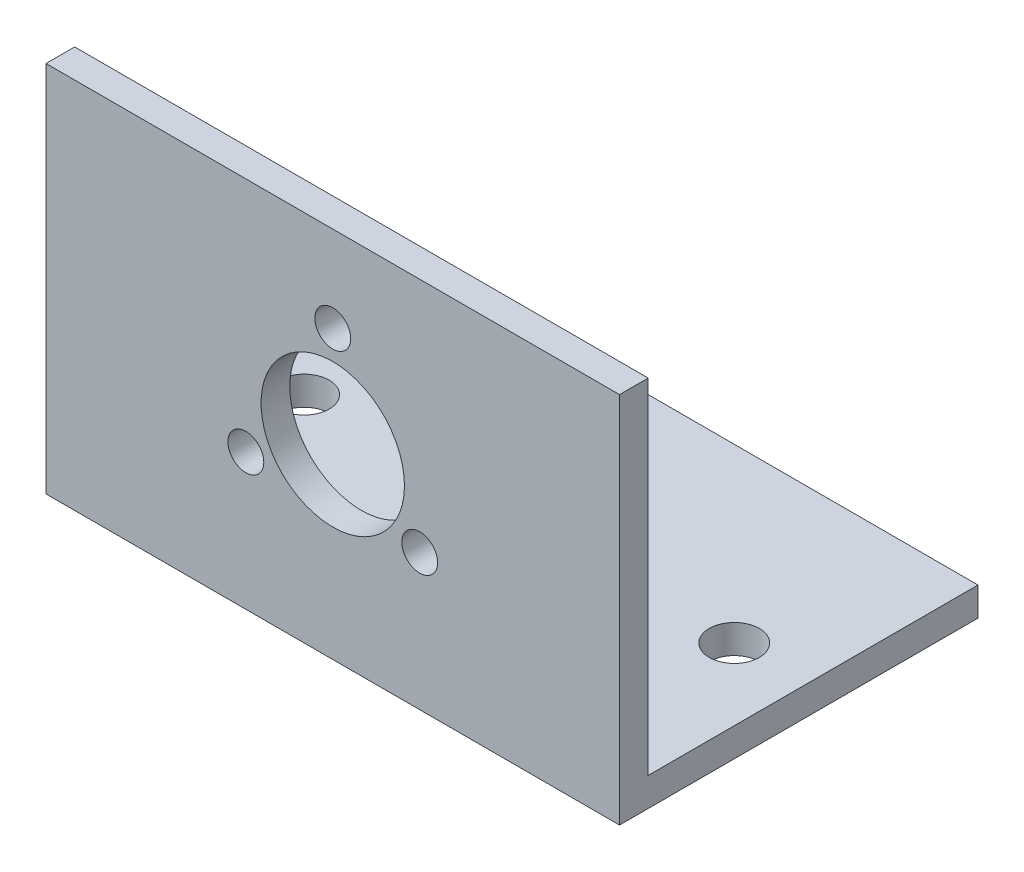
ISO-10303-21;
HEADER;
FILE_DESCRIPTION(('STEP AP214'),'2;1');
FILE_NAME('part.step','',(''),(''),'','','');
FILE_SCHEMA(('AUTOMOTIVE_DESIGN { 1 0 10303 214 1 1 1 1 }'));
ENDSEC;
DATA;
#1=APPLICATION_CONTEXT('core data for automotive mechanical design processes');
#2=APPLICATION_PROTOCOL_DEFINITION('international standard','automotive_design',2000,#1);
#3=PRODUCT_CONTEXT('',#1,'mechanical');
#4=PRODUCT('Part','Part','',(#3));
#5=PRODUCT_RELATED_PRODUCT_CATEGORY('part','',(#4));
#6=PRODUCT_DEFINITION_FORMATION('','',#4);
#7=PRODUCT_DEFINITION_CONTEXT('part definition',#1,'design');
#8=PRODUCT_DEFINITION('design','',#6,#7);
#9=PRODUCT_DEFINITION_SHAPE('','',#8);
#10=(LENGTH_UNIT() NAMED_UNIT(*) SI_UNIT(.MILLI.,.METRE.));
#11=(NAMED_UNIT(*) PLANE_ANGLE_UNIT() SI_UNIT($,.RADIAN.));
#12=(NAMED_UNIT(*) SI_UNIT($,.STERADIAN.) SOLID_ANGLE_UNIT());
#13=UNCERTAINTY_MEASURE_WITH_UNIT(LENGTH_MEASURE(1.E-05),#10,'distance_accuracy_value','');
#14=(GEOMETRIC_REPRESENTATION_CONTEXT(3) GLOBAL_UNCERTAINTY_ASSIGNED_CONTEXT((#13)) GLOBAL_UNIT_ASSIGNED_CONTEXT((#10,
#11,#12)) REPRESENTATION_CONTEXT('',''));
#15=CARTESIAN_POINT('',(0.,0.,0.));
#16=DIRECTION('',(0.,0.,1.));
#17=DIRECTION('',(1.,0.,0.));
#18=AXIS2_PLACEMENT_3D('',#15,#16,#17);
#19=CARTESIAN_POINT('',(0.,2.,0.));
#20=DIRECTION('',(0.,-1.,0.));
#21=DIRECTION('',(0.,0.,-1.));
#22=AXIS2_PLACEMENT_3D('',#19,#20,#21);
#23=PLANE('',#22);
#24=CARTESIAN_POINT('',(-15.,2.,-0.499999999999995));
#25=DIRECTION('',(0.,-1.,0.));
#26=DIRECTION('',(0.,0.,-1.));
#27=AXIS2_PLACEMENT_3D('',#24,#25,#26);
#28=CIRCLE('',#27,1.75);
#29=CARTESIAN_POINT('',(-15.,2.,-2.25));
#30=VERTEX_POINT('',#29);
#31=EDGE_CURVE('E157',#30,#30,#28,.T.);
#32=ORIENTED_EDGE('',*,*,#31,.T.);
#33=EDGE_LOOP('',(#32));
#34=FACE_BOUND('',#33,.T.);
#35=CARTESIAN_POINT('',(15.,2.,-0.49999999999999));
#36=DIRECTION('',(0.,-1.,0.));
#37=DIRECTION('',(0.,0.,-1.));
#38=AXIS2_PLACEMENT_3D('',#35,#36,#37);
#39=CIRCLE('',#38,1.75);
#40=CARTESIAN_POINT('',(15.,2.,-2.24999999999999));
#41=VERTEX_POINT('',#40);
#42=EDGE_CURVE('E152',#41,#41,#39,.T.);
#43=ORIENTED_EDGE('',*,*,#42,.T.);
#44=EDGE_LOOP('',(#43));
#45=FACE_BOUND('',#44,.T.);
#46=DIRECTION('',(-1.,0.,0.));
#47=VECTOR('',#46,1.);
#48=CARTESIAN_POINT('',(-20.,2.,10.5));
#49=LINE('',#48,#47);
#50=CARTESIAN_POINT('',(20.,2.,10.5));
#51=VERTEX_POINT('',#50);
#52=CARTESIAN_POINT('',(-20.,2.,10.5));
#53=VERTEX_POINT('',#52);
#54=EDGE_CURVE('E57',#51,#53,#49,.T.);
#55=ORIENTED_EDGE('',*,*,#54,.F.);
#56=DIRECTION('',(0.,0.,-1.));
#57=VECTOR('',#56,1.);
#58=CARTESIAN_POINT('',(20.,2.,12.5));
#59=LINE('',#58,#57);
#60=CARTESIAN_POINT('',(20.,2.,-12.5));
#61=VERTEX_POINT('',#60);
#62=EDGE_CURVE('E95',#51,#61,#59,.T.);
#63=ORIENTED_EDGE('',*,*,#62,.T.);
#64=DIRECTION('',(-1.,0.,0.));
#65=VECTOR('',#64,1.);
#66=CARTESIAN_POINT('',(-20.,2.,-12.5));
#67=LINE('',#66,#65);
#68=CARTESIAN_POINT('',(-20.,2.,-12.5));
#69=VERTEX_POINT('',#68);
#70=EDGE_CURVE('E63',#61,#69,#67,.T.);
#71=ORIENTED_EDGE('',*,*,#70,.T.);
#72=DIRECTION('',(0.,0.,1.));
#73=VECTOR('',#72,1.);
#74=CARTESIAN_POINT('',(-20.,2.,12.5));
#75=LINE('',#74,#73);
#76=EDGE_CURVE('E106',#69,#53,#75,.T.);
#77=ORIENTED_EDGE('',*,*,#76,.T.);
#78=EDGE_LOOP('',(#55,#63,#71,#77));
#79=FACE_BOUND('',#78,.T.);
#80=ADVANCED_FACE('F40',(#34,#45,#79),#23,.F.);
#81=CARTESIAN_POINT('',(20.,2.,12.5));
#82=DIRECTION('',(-1.,0.,0.));
#83=DIRECTION('',(0.,0.,1.));
#84=AXIS2_PLACEMENT_3D('',#81,#82,#83);
#85=PLANE('',#84);
#86=DIRECTION('',(0.,0.,-1.));
#87=VECTOR('',#86,1.);
#88=CARTESIAN_POINT('',(20.,0.,12.5));
#89=LINE('',#88,#87);
#90=CARTESIAN_POINT('',(20.,0.,12.5));
#91=VERTEX_POINT('',#90);
#92=CARTESIAN_POINT('',(20.,0.,-12.5));
#93=VERTEX_POINT('',#92);
#94=EDGE_CURVE('E102',#91,#93,#89,.T.);
#95=ORIENTED_EDGE('',*,*,#94,.T.);
#96=DIRECTION('',(0.,-1.,0.));
#97=VECTOR('',#96,1.);
#98=CARTESIAN_POINT('',(20.,2.,-12.5));
#99=LINE('',#98,#97);
#100=EDGE_CURVE('E11',#61,#93,#99,.T.);
#101=ORIENTED_EDGE('',*,*,#100,.F.);
#102=ORIENTED_EDGE('',*,*,#62,.F.);
#103=DIRECTION('',(0.,-1.,0.));
#104=VECTOR('',#103,1.);
#105=CARTESIAN_POINT('',(20.,26.,10.5));
#106=LINE('',#105,#104);
#107=CARTESIAN_POINT('',(20.,26.,10.5));
#108=VERTEX_POINT('',#107);
#109=EDGE_CURVE('E110',#108,#51,#106,.T.);
#110=ORIENTED_EDGE('',*,*,#109,.F.);
#111=DIRECTION('',(0.,0.,-1.));
#112=VECTOR('',#111,1.);
#113=CARTESIAN_POINT('',(20.,26.,10.5));
#114=LINE('',#113,#112);
#115=CARTESIAN_POINT('',(20.,26.,12.5));
#116=VERTEX_POINT('',#115);
#117=EDGE_CURVE('E105',#116,#108,#114,.T.);
#118=ORIENTED_EDGE('',*,*,#117,.F.);
#119=DIRECTION('',(0.,-1.,0.));
#120=VECTOR('',#119,1.);
#121=CARTESIAN_POINT('',(20.,2.,12.5));
#122=LINE('',#121,#120);
#123=EDGE_CURVE('E88',#116,#91,#122,.T.);
#124=ORIENTED_EDGE('',*,*,#123,.T.);
#125=EDGE_LOOP('',(#95,#101,#102,#110,#118,#124));
#126=FACE_BOUND('',#125,.T.);
#127=ADVANCED_FACE('F42',(#126),#85,.F.);
#128=CARTESIAN_POINT('',(-20.,2.,-12.5));
#129=DIRECTION('',(0.,0.,1.));
#130=DIRECTION('',(1.,0.,0.));
#131=AXIS2_PLACEMENT_3D('',#128,#129,#130);
#132=PLANE('',#131);
#133=DIRECTION('',(-1.,0.,0.));
#134=VECTOR('',#133,1.);
#135=CARTESIAN_POINT('',(-20.,0.,-12.5));
#136=LINE('',#135,#134);
#137=CARTESIAN_POINT('',(-20.,0.,-12.5));
#138=VERTEX_POINT('',#137);
#139=EDGE_CURVE('E109',#93,#138,#136,.T.);
#140=ORIENTED_EDGE('',*,*,#139,.T.);
#141=DIRECTION('',(0.,-1.,0.));
#142=VECTOR('',#141,1.);
#143=CARTESIAN_POINT('',(-20.,2.,-12.5));
#144=LINE('',#143,#142);
#145=EDGE_CURVE('E49',#69,#138,#144,.T.);
#146=ORIENTED_EDGE('',*,*,#145,.F.);
#147=ORIENTED_EDGE('',*,*,#70,.F.);
#148=ORIENTED_EDGE('',*,*,#100,.T.);
#149=EDGE_LOOP('',(#140,#146,#147,#148));
#150=FACE_BOUND('',#149,.T.);
#151=ADVANCED_FACE('F190',(#150),#132,.F.);
#152=CARTESIAN_POINT('',(-20.,2.,12.5));
#153=DIRECTION('',(1.,0.,0.));
#154=DIRECTION('',(0.,0.,-1.));
#155=AXIS2_PLACEMENT_3D('',#152,#153,#154);
#156=PLANE('',#155);
#157=DIRECTION('',(0.,0.,1.));
#158=VECTOR('',#157,1.);
#159=CARTESIAN_POINT('',(-20.,0.,12.5));
#160=LINE('',#159,#158);
#161=CARTESIAN_POINT('',(-20.,0.,12.5));
#162=VERTEX_POINT('',#161);
#163=EDGE_CURVE('E96',#138,#162,#160,.T.);
#164=ORIENTED_EDGE('',*,*,#163,.T.);
#165=DIRECTION('',(0.,-1.,0.));
#166=VECTOR('',#165,1.);
#167=CARTESIAN_POINT('',(-20.,2.,12.5));
#168=LINE('',#167,#166);
#169=CARTESIAN_POINT('',(-20.,26.,12.5));
#170=VERTEX_POINT('',#169);
#171=EDGE_CURVE('E91',#170,#162,#168,.T.);
#172=ORIENTED_EDGE('',*,*,#171,.F.);
#173=DIRECTION('',(0.,0.,1.));
#174=VECTOR('',#173,1.);
#175=CARTESIAN_POINT('',(-20.,26.,10.5));
#176=LINE('',#175,#174);
#177=CARTESIAN_POINT('',(-20.,26.,10.5));
#178=VERTEX_POINT('',#177);
#179=EDGE_CURVE('E160',#178,#170,#176,.T.);
#180=ORIENTED_EDGE('',*,*,#179,.F.);
#181=DIRECTION('',(0.,-1.,0.));
#182=VECTOR('',#181,1.);
#183=CARTESIAN_POINT('',(-20.,26.,10.5));
#184=LINE('',#183,#182);
#185=EDGE_CURVE('E114',#178,#53,#184,.T.);
#186=ORIENTED_EDGE('',*,*,#185,.T.);
#187=ORIENTED_EDGE('',*,*,#76,.F.);
#188=ORIENTED_EDGE('',*,*,#145,.T.);
#189=EDGE_LOOP('',(#164,#172,#180,#186,#187,#188));
#190=FACE_BOUND('',#189,.T.);
#191=ADVANCED_FACE('F181',(#190),#156,.F.);
#192=CARTESIAN_POINT('',(-20.,2.,12.5));
#193=DIRECTION('',(0.,0.,-1.));
#194=DIRECTION('',(-1.,0.,0.));
#195=AXIS2_PLACEMENT_3D('',#192,#193,#194);
#196=PLANE('',#195);
#197=CARTESIAN_POINT('',(-6.06217782649105,9.49999999999998,12.5));
#198=DIRECTION('',(0.,0.,1.));
#199=DIRECTION('',(-0.500000000000004,0.866025403784436,0.));
#200=AXIS2_PLACEMENT_3D('',#197,#198,#199);
#201=CIRCLE('',#200,1.25);
#202=CARTESIAN_POINT('',(-6.68717782649106,10.5825317547305,12.5));
#203=VERTEX_POINT('',#202);
#204=EDGE_CURVE('E133',#203,#203,#201,.T.);
#205=ORIENTED_EDGE('',*,*,#204,.F.);
#206=EDGE_LOOP('',(#205));
#207=FACE_BOUND('',#206,.T.);
#208=CARTESIAN_POINT('',(6.06217782649111,9.50000000000006,12.5));
#209=DIRECTION('',(0.,0.,1.));
#210=DIRECTION('',(-0.499999999999992,-0.866025403784443,0.));
#211=AXIS2_PLACEMENT_3D('',#208,#209,#210);
#212=CIRCLE('',#211,1.25);
#213=CARTESIAN_POINT('',(5.43717782649111,8.4174682452695,12.5));
#214=VERTEX_POINT('',#213);
#215=EDGE_CURVE('E138',#214,#214,#212,.T.);
#216=ORIENTED_EDGE('',*,*,#215,.F.);
#217=EDGE_LOOP('',(#216));
#218=FACE_BOUND('',#217,.T.);
#219=CARTESIAN_POINT('',(0.,20.,12.5));
#220=DIRECTION('',(0.,0.,1.));
#221=DIRECTION('',(1.,0.,0.));
#222=AXIS2_PLACEMENT_3D('',#219,#220,#221);
#223=CIRCLE('',#222,1.25);
#224=CARTESIAN_POINT('',(1.25,20.,12.5));
#225=VERTEX_POINT('',#224);
#226=EDGE_CURVE('E130',#225,#225,#223,.T.);
#227=ORIENTED_EDGE('',*,*,#226,.F.);
#228=EDGE_LOOP('',(#227));
#229=FACE_BOUND('',#228,.T.);
#230=CARTESIAN_POINT('',(0.,13.,12.5));
#231=DIRECTION('',(0.,0.,1.));
#232=DIRECTION('',(1.,0.,0.));
#233=AXIS2_PLACEMENT_3D('',#230,#231,#232);
#234=CIRCLE('',#233,5.);
#235=CARTESIAN_POINT('',(5.,13.,12.5));
#236=VERTEX_POINT('',#235);
#237=EDGE_CURVE('E127',#236,#236,#234,.T.);
#238=ORIENTED_EDGE('',*,*,#237,.F.);
#239=EDGE_LOOP('',(#238));
#240=FACE_BOUND('',#239,.T.);
#241=DIRECTION('',(1.,0.,0.));
#242=VECTOR('',#241,1.);
#243=CARTESIAN_POINT('',(-20.,0.,12.5));
#244=LINE('',#243,#242);
#245=EDGE_CURVE('E83',#162,#91,#244,.T.);
#246=ORIENTED_EDGE('',*,*,#245,.T.);
#247=ORIENTED_EDGE('',*,*,#123,.F.);
#248=DIRECTION('',(1.,0.,0.));
#249=VECTOR('',#248,1.);
#250=CARTESIAN_POINT('',(-20.,26.,12.5));
#251=LINE('',#250,#249);
#252=EDGE_CURVE('E163',#170,#116,#251,.T.);
#253=ORIENTED_EDGE('',*,*,#252,.F.);
#254=ORIENTED_EDGE('',*,*,#171,.T.);
#255=EDGE_LOOP('',(#246,#247,#253,#254));
#256=FACE_BOUND('',#255,.T.);
#257=ADVANCED_FACE('F85',(#207,#218,#229,#240,#256),#196,.F.);
#258=CARTESIAN_POINT('',(0.,0.,0.));
#259=DIRECTION('',(0.,-1.,0.));
#260=DIRECTION('',(0.,0.,-1.));
#261=AXIS2_PLACEMENT_3D('',#258,#259,#260);
#262=PLANE('',#261);
#263=CARTESIAN_POINT('',(-15.,0.,-0.499999999999995));
#264=DIRECTION('',(0.,-1.,0.));
#265=DIRECTION('',(0.,0.,-1.));
#266=AXIS2_PLACEMENT_3D('',#263,#264,#265);
#267=CIRCLE('',#266,1.75);
#268=CARTESIAN_POINT('',(-15.,0.,-2.25));
#269=VERTEX_POINT('',#268);
#270=EDGE_CURVE('E149',#269,#269,#267,.T.);
#271=ORIENTED_EDGE('',*,*,#270,.F.);
#272=EDGE_LOOP('',(#271));
#273=FACE_BOUND('',#272,.T.);
#274=CARTESIAN_POINT('',(15.,0.,-0.49999999999999));
#275=DIRECTION('',(0.,-1.,0.));
#276=DIRECTION('',(0.,0.,-1.));
#277=AXIS2_PLACEMENT_3D('',#274,#275,#276);
#278=CIRCLE('',#277,1.75);
#279=CARTESIAN_POINT('',(15.,0.,-2.24999999999999));
#280=VERTEX_POINT('',#279);
#281=EDGE_CURVE('E126',#280,#280,#278,.T.);
#282=ORIENTED_EDGE('',*,*,#281,.F.);
#283=EDGE_LOOP('',(#282));
#284=FACE_BOUND('',#283,.T.);
#285=ORIENTED_EDGE('',*,*,#94,.F.);
#286=ORIENTED_EDGE('',*,*,#245,.F.);
#287=ORIENTED_EDGE('',*,*,#163,.F.);
#288=ORIENTED_EDGE('',*,*,#139,.F.);
#289=EDGE_LOOP('',(#285,#286,#287,#288));
#290=FACE_BOUND('',#289,.T.);
#291=ADVANCED_FACE('F108',(#273,#284,#290),#262,.T.);
#292=CARTESIAN_POINT('',(-20.,26.,10.5));
#293=DIRECTION('',(0.,0.,1.));
#294=DIRECTION('',(1.,0.,0.));
#295=AXIS2_PLACEMENT_3D('',#292,#293,#294);
#296=PLANE('',#295);
#297=CARTESIAN_POINT('',(-6.06217782649105,9.49999999999998,10.5));
#298=DIRECTION('',(0.,0.,1.));
#299=DIRECTION('',(1.,0.,0.));
#300=AXIS2_PLACEMENT_3D('',#297,#298,#299);
#301=CIRCLE('',#300,1.25);
#302=CARTESIAN_POINT('',(-4.81217782649105,9.49999999999998,10.5));
#303=VERTEX_POINT('',#302);
#304=EDGE_CURVE('E44',#303,#303,#301,.T.);
#305=ORIENTED_EDGE('',*,*,#304,.T.);
#306=EDGE_LOOP('',(#305));
#307=FACE_BOUND('',#306,.T.);
#308=CARTESIAN_POINT('',(6.06217782649111,9.50000000000006,10.5));
#309=DIRECTION('',(0.,0.,1.));
#310=DIRECTION('',(1.,0.,0.));
#311=AXIS2_PLACEMENT_3D('',#308,#309,#310);
#312=CIRCLE('',#311,1.25);
#313=CARTESIAN_POINT('',(7.31217782649111,9.50000000000006,10.5));
#314=VERTEX_POINT('',#313);
#315=EDGE_CURVE('E131',#314,#314,#312,.T.);
#316=ORIENTED_EDGE('',*,*,#315,.T.);
#317=EDGE_LOOP('',(#316));
#318=FACE_BOUND('',#317,.T.);
#319=CARTESIAN_POINT('',(0.,20.,10.5));
#320=DIRECTION('',(0.,0.,1.));
#321=DIRECTION('',(1.,0.,0.));
#322=AXIS2_PLACEMENT_3D('',#319,#320,#321);
#323=CIRCLE('',#322,1.25);
#324=CARTESIAN_POINT('',(1.25,20.,10.5));
#325=VERTEX_POINT('',#324);
#326=EDGE_CURVE('E128',#325,#325,#323,.T.);
#327=ORIENTED_EDGE('',*,*,#326,.T.);
#328=EDGE_LOOP('',(#327));
#329=FACE_BOUND('',#328,.T.);
#330=CARTESIAN_POINT('',(0.,13.,10.5));
#331=DIRECTION('',(0.,0.,1.));
#332=DIRECTION('',(1.,0.,0.));
#333=AXIS2_PLACEMENT_3D('',#330,#331,#332);
#334=CIRCLE('',#333,5.);
#335=CARTESIAN_POINT('',(5.,13.,10.5));
#336=VERTEX_POINT('',#335);
#337=EDGE_CURVE('E123',#336,#336,#334,.T.);
#338=ORIENTED_EDGE('',*,*,#337,.T.);
#339=EDGE_LOOP('',(#338));
#340=FACE_BOUND('',#339,.T.);
#341=ORIENTED_EDGE('',*,*,#54,.T.);
#342=ORIENTED_EDGE('',*,*,#185,.F.);
#343=DIRECTION('',(-1.,0.,0.));
#344=VECTOR('',#343,1.);
#345=CARTESIAN_POINT('',(-20.,26.,10.5));
#346=LINE('',#345,#344);
#347=EDGE_CURVE('E166',#108,#178,#346,.T.);
#348=ORIENTED_EDGE('',*,*,#347,.F.);
#349=ORIENTED_EDGE('',*,*,#109,.T.);
#350=EDGE_LOOP('',(#341,#342,#348,#349));
#351=FACE_BOUND('',#350,.T.);
#352=ADVANCED_FACE('F178',(#307,#318,#329,#340,#351),#296,.F.);
#353=CARTESIAN_POINT('',(0.,26.,0.));
#354=DIRECTION('',(0.,1.,0.));
#355=DIRECTION('',(0.,0.,1.));
#356=AXIS2_PLACEMENT_3D('',#353,#354,#355);
#357=PLANE('',#356);
#358=ORIENTED_EDGE('',*,*,#179,.T.);
#359=ORIENTED_EDGE('',*,*,#252,.T.);
#360=ORIENTED_EDGE('',*,*,#117,.T.);
#361=ORIENTED_EDGE('',*,*,#347,.T.);
#362=EDGE_LOOP('',(#358,#359,#360,#361));
#363=FACE_BOUND('',#362,.T.);
#364=ADVANCED_FACE('F185',(#363),#357,.T.);
#365=CARTESIAN_POINT('',(15.,26.,-0.49999999999999));
#366=DIRECTION('',(0.,-1.,0.));
#367=DIRECTION('',(0.,0.,-1.));
#368=AXIS2_PLACEMENT_3D('',#365,#366,#367);
#369=CYLINDRICAL_SURFACE('',#368,1.75);
#370=ORIENTED_EDGE('',*,*,#281,.T.);
#371=EDGE_LOOP('',(#370));
#372=FACE_BOUND('',#371,.T.);
#373=ORIENTED_EDGE('',*,*,#42,.F.);
#374=EDGE_LOOP('',(#373));
#375=FACE_BOUND('',#374,.T.);
#376=ADVANCED_FACE('F233',(#372,#375),#369,.F.);
#377=CARTESIAN_POINT('',(-15.,26.,-0.499999999999995));
#378=DIRECTION('',(0.,-1.,0.));
#379=DIRECTION('',(0.,0.,-1.));
#380=AXIS2_PLACEMENT_3D('',#377,#378,#379);
#381=CYLINDRICAL_SURFACE('',#380,1.75);
#382=ORIENTED_EDGE('',*,*,#270,.T.);
#383=EDGE_LOOP('',(#382));
#384=FACE_BOUND('',#383,.T.);
#385=ORIENTED_EDGE('',*,*,#31,.F.);
#386=EDGE_LOOP('',(#385));
#387=FACE_BOUND('',#386,.T.);
#388=ADVANCED_FACE('F224',(#384,#387),#381,.F.);
#389=CARTESIAN_POINT('',(0.,13.,-12.5));
#390=DIRECTION('',(0.,0.,1.));
#391=DIRECTION('',(1.,0.,0.));
#392=AXIS2_PLACEMENT_3D('',#389,#390,#391);
#393=CYLINDRICAL_SURFACE('',#392,5.);
#394=ORIENTED_EDGE('',*,*,#237,.T.);
#395=EDGE_LOOP('',(#394));
#396=FACE_BOUND('',#395,.T.);
#397=ORIENTED_EDGE('',*,*,#337,.F.);
#398=EDGE_LOOP('',(#397));
#399=FACE_BOUND('',#398,.T.);
#400=ADVANCED_FACE('F220',(#396,#399),#393,.F.);
#401=CARTESIAN_POINT('',(0.,20.,-12.5));
#402=DIRECTION('',(0.,0.,1.));
#403=DIRECTION('',(1.,0.,0.));
#404=AXIS2_PLACEMENT_3D('',#401,#402,#403);
#405=CYLINDRICAL_SURFACE('',#404,1.25);
#406=ORIENTED_EDGE('',*,*,#226,.T.);
#407=EDGE_LOOP('',(#406));
#408=FACE_BOUND('',#407,.T.);
#409=ORIENTED_EDGE('',*,*,#326,.F.);
#410=EDGE_LOOP('',(#409));
#411=FACE_BOUND('',#410,.T.);
#412=ADVANCED_FACE('F223',(#408,#411),#405,.F.);
#413=CARTESIAN_POINT('',(6.06217782649111,9.50000000000006,-12.5));
#414=DIRECTION('',(0.,0.,1.));
#415=DIRECTION('',(1.,0.,0.));
#416=AXIS2_PLACEMENT_3D('',#413,#414,#415);
#417=CYLINDRICAL_SURFACE('',#416,1.25);
#418=ORIENTED_EDGE('',*,*,#215,.T.);
#419=EDGE_LOOP('',(#418));
#420=FACE_BOUND('',#419,.T.);
#421=ORIENTED_EDGE('',*,*,#315,.F.);
#422=EDGE_LOOP('',(#421));
#423=FACE_BOUND('',#422,.T.);
#424=ADVANCED_FACE('F239',(#420,#423),#417,.F.);
#425=CARTESIAN_POINT('',(-6.06217782649105,9.49999999999998,-12.5));
#426=DIRECTION('',(0.,0.,1.));
#427=DIRECTION('',(1.,0.,0.));
#428=AXIS2_PLACEMENT_3D('',#425,#426,#427);
#429=CYLINDRICAL_SURFACE('',#428,1.25);
#430=ORIENTED_EDGE('',*,*,#204,.T.);
#431=EDGE_LOOP('',(#430));
#432=FACE_BOUND('',#431,.T.);
#433=ORIENTED_EDGE('',*,*,#304,.F.);
#434=EDGE_LOOP('',(#433));
#435=FACE_BOUND('',#434,.T.);
#436=ADVANCED_FACE('F245',(#432,#435),#429,.F.);
#437=CLOSED_SHELL('',(#80,#127,#151,#191,#257,#291,#352,#364,#376,#388,#400,#412,#424,#436));
#438=MANIFOLD_SOLID_BREP('B2',#437);
#439=ADVANCED_BREP_SHAPE_REPRESENTATION('',(#18,#438),#14);
#440=SHAPE_DEFINITION_REPRESENTATION(#9,#439);
ENDSEC;
END-ISO-10303-21;
